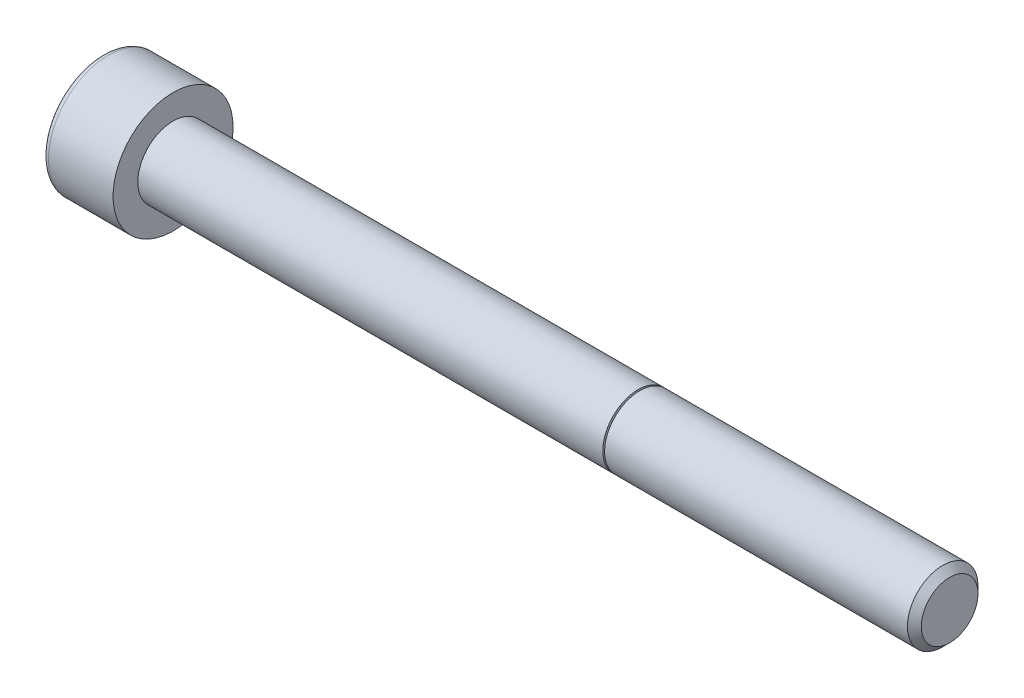
ISO-10303-21;
HEADER;
FILE_DESCRIPTION(('STEP AP214'),'2;1');
FILE_NAME('part.step','',(''),(''),'','','');
FILE_SCHEMA(('AUTOMOTIVE_DESIGN { 1 0 10303 214 1 1 1 1 }'));
ENDSEC;
DATA;
#1=APPLICATION_CONTEXT('core data for automotive mechanical design processes');
#2=APPLICATION_PROTOCOL_DEFINITION('international standard','automotive_design',2000,#1);
#3=PRODUCT_CONTEXT('',#1,'mechanical');
#4=PRODUCT('Part','Part','',(#3));
#5=PRODUCT_RELATED_PRODUCT_CATEGORY('part','',(#4));
#6=PRODUCT_DEFINITION_FORMATION('','',#4);
#7=PRODUCT_DEFINITION_CONTEXT('part definition',#1,'design');
#8=PRODUCT_DEFINITION('design','',#6,#7);
#9=PRODUCT_DEFINITION_SHAPE('','',#8);
#10=(LENGTH_UNIT() NAMED_UNIT(*) SI_UNIT(.MILLI.,.METRE.));
#11=(NAMED_UNIT(*) PLANE_ANGLE_UNIT() SI_UNIT($,.RADIAN.));
#12=(NAMED_UNIT(*) SI_UNIT($,.STERADIAN.) SOLID_ANGLE_UNIT());
#13=UNCERTAINTY_MEASURE_WITH_UNIT(LENGTH_MEASURE(1.E-05),#10,'distance_accuracy_value','');
#14=(GEOMETRIC_REPRESENTATION_CONTEXT(3) GLOBAL_UNCERTAINTY_ASSIGNED_CONTEXT((#13)) GLOBAL_UNIT_ASSIGNED_CONTEXT((#10,
#11,#12)) REPRESENTATION_CONTEXT('',''));
#15=CARTESIAN_POINT('',(0.,0.,0.));
#16=DIRECTION('',(0.,0.,1.));
#17=DIRECTION('',(1.,0.,0.));
#18=AXIS2_PLACEMENT_3D('',#15,#16,#17);
#19=CARTESIAN_POINT('',(55.,-2.04969,2.0095));
#20=DIRECTION('',(1.,0.,0.));
#21=DIRECTION('',(0.,0.,-1.));
#22=AXIS2_PLACEMENT_3D('',#19,#20,#21);
#23=PLANE('',#22);
#24=CARTESIAN_POINT('',(55.,0.,0.));
#25=DIRECTION('',(-1.,0.,0.));
#26=DIRECTION('',(0.,0.,1.));
#27=AXIS2_PLACEMENT_3D('',#24,#25,#26);
#28=CIRCLE('',#27,2.0095);
#29=CARTESIAN_POINT('',(55.,0.,2.0095));
#30=VERTEX_POINT('',#29);
#31=EDGE_CURVE('E20',#30,#30,#28,.T.);
#32=ORIENTED_EDGE('',*,*,#31,.F.);
#33=EDGE_LOOP('',(#32));
#34=FACE_BOUND('',#33,.T.);
#35=ADVANCED_FACE('F16',(#34),#23,.T.);
#36=CARTESIAN_POINT('',(55.,0.,0.));
#37=DIRECTION('',(-1.,0.,0.));
#38=DIRECTION('',(0.,0.,1.));
#39=AXIS2_PLACEMENT_3D('',#36,#37,#38);
#40=CONICAL_SURFACE('',#39,2.0095,0.78539816339745);
#41=ORIENTED_EDGE('',*,*,#31,.T.);
#42=EDGE_LOOP('',(#41));
#43=FACE_BOUND('',#42,.T.);
#44=CARTESIAN_POINT('',(54.5095,0.,0.));
#45=DIRECTION('',(-1.,0.,0.));
#46=DIRECTION('',(0.,-1.,0.));
#47=AXIS2_PLACEMENT_3D('',#44,#45,#46);
#48=CIRCLE('',#47,2.5);
#49=CARTESIAN_POINT('',(54.5095,-2.50000000000004,0.));
#50=VERTEX_POINT('',#49);
#51=EDGE_CURVE('E122',#50,#50,#48,.T.);
#52=ORIENTED_EDGE('',*,*,#51,.F.);
#53=EDGE_LOOP('',(#52));
#54=FACE_BOUND('',#53,.T.);
#55=ADVANCED_FACE('F235',(#43,#54),#40,.T.);
#56=CARTESIAN_POINT('',(54.5095,0.,0.));
#57=DIRECTION('',(-1.,0.,0.));
#58=DIRECTION('',(0.,-1.,0.));
#59=AXIS2_PLACEMENT_3D('',#56,#57,#58);
#60=CYLINDRICAL_SURFACE('',#59,2.5);
#61=CARTESIAN_POINT('',(33.0613125,0.,0.));
#62=DIRECTION('',(-1.,0.,0.));
#63=DIRECTION('',(0.,0.,1.));
#64=AXIS2_PLACEMENT_3D('',#61,#62,#63);
#65=CIRCLE('',#64,2.5);
#66=CARTESIAN_POINT('',(33.0613125,0.,2.5));
#67=VERTEX_POINT('',#66);
#68=EDGE_CURVE('E119',#67,#67,#65,.T.);
#69=ORIENTED_EDGE('',*,*,#68,.F.);
#70=EDGE_LOOP('',(#69));
#71=FACE_BOUND('',#70,.T.);
#72=ORIENTED_EDGE('',*,*,#51,.T.);
#73=EDGE_LOOP('',(#72));
#74=FACE_BOUND('',#73,.T.);
#75=ADVANCED_FACE('F229',(#71,#74),#60,.T.);
#76=CARTESIAN_POINT('',(33.,0.,0.));
#77=DIRECTION('',(1.,0.,0.));
#78=DIRECTION('',(0.,0.,-1.));
#79=AXIS2_PLACEMENT_3D('',#76,#77,#78);
#80=CONICAL_SURFACE('',#79,2.0095,1.44644133224812);
#81=CARTESIAN_POINT('',(33.,0.,0.));
#82=DIRECTION('',(-1.,0.,0.));
#83=DIRECTION('',(0.,0.,1.));
#84=AXIS2_PLACEMENT_3D('',#81,#82,#83);
#85=CIRCLE('',#84,2.0095);
#86=CARTESIAN_POINT('',(33.,0.,2.0095));
#87=VERTEX_POINT('',#86);
#88=EDGE_CURVE('E116',#87,#87,#85,.T.);
#89=ORIENTED_EDGE('',*,*,#88,.F.);
#90=EDGE_LOOP('',(#89));
#91=FACE_BOUND('',#90,.T.);
#92=ORIENTED_EDGE('',*,*,#68,.T.);
#93=EDGE_LOOP('',(#92));
#94=FACE_BOUND('',#93,.T.);
#95=ADVANCED_FACE('F223',(#91,#94),#80,.T.);
#96=CARTESIAN_POINT('',(32.9386875,0.,0.));
#97=DIRECTION('',(-1.,0.,0.));
#98=DIRECTION('',(0.,0.,1.));
#99=AXIS2_PLACEMENT_3D('',#96,#97,#98);
#100=CONICAL_SURFACE('',#99,2.5,1.44644133224812);
#101=CARTESIAN_POINT('',(32.9386875,0.,0.));
#102=DIRECTION('',(-1.,0.,0.));
#103=DIRECTION('',(0.,0.,1.));
#104=AXIS2_PLACEMENT_3D('',#101,#102,#103);
#105=CIRCLE('',#104,2.5);
#106=CARTESIAN_POINT('',(32.9386875,0.,2.49999999999996));
#107=VERTEX_POINT('',#106);
#108=EDGE_CURVE('E113',#107,#107,#105,.T.);
#109=ORIENTED_EDGE('',*,*,#108,.F.);
#110=EDGE_LOOP('',(#109));
#111=FACE_BOUND('',#110,.T.);
#112=ORIENTED_EDGE('',*,*,#88,.T.);
#113=EDGE_LOOP('',(#112));
#114=FACE_BOUND('',#113,.T.);
#115=ADVANCED_FACE('F218',(#111,#114),#100,.T.);
#116=CARTESIAN_POINT('',(32.9386875,0.,0.));
#117=DIRECTION('',(-1.,0.,0.));
#118=DIRECTION('',(0.,0.,1.));
#119=AXIS2_PLACEMENT_3D('',#116,#117,#118);
#120=CYLINDRICAL_SURFACE('',#119,2.5);
#121=CARTESIAN_POINT('',(0.,0.,0.));
#122=DIRECTION('',(-1.,0.,0.));
#123=DIRECTION('',(0.,0.,1.));
#124=AXIS2_PLACEMENT_3D('',#121,#122,#123);
#125=CIRCLE('',#124,2.5);
#126=CARTESIAN_POINT('',(0.,0.,2.49999999999996));
#127=VERTEX_POINT('',#126);
#128=EDGE_CURVE('E92',#127,#127,#125,.T.);
#129=ORIENTED_EDGE('',*,*,#128,.F.);
#130=EDGE_LOOP('',(#129));
#131=FACE_BOUND('',#130,.T.);
#132=ORIENTED_EDGE('',*,*,#108,.T.);
#133=EDGE_LOOP('',(#132));
#134=FACE_BOUND('',#133,.T.);
#135=ADVANCED_FACE('F215',(#131,#134),#120,.T.);
#136=CARTESIAN_POINT('',(-1.9,0.,0.));
#137=DIRECTION('',(-1.,0.,0.));
#138=DIRECTION('',(0.,0.,1.));
#139=AXIS2_PLACEMENT_3D('',#136,#137,#138);
#140=CONICAL_SURFACE('',#139,2.3094010767585,1.0471975511966);
#141=CARTESIAN_POINT('',(-1.9,0.,2.3094010767585));
#142=CARTESIAN_POINT('',(-1.87069554512665,-0.0878878875630438,2.25865898121547));
#143=CARTESIAN_POINT('',(-1.84404467710022,-0.176534422121215,2.20747888062559));
#144=CARTESIAN_POINT('',(-1.79752638740027,-0.355362346686105,2.10423253023943));
#145=CARTESIAN_POINT('',(-1.77767542033809,-0.44554691308464,2.05216444655249));
#146=CARTESIAN_POINT('',(-1.74677595894609,-0.624798433758891,1.94867353283856));
#147=CARTESIAN_POINT('',(-1.73552178759691,-0.713837815616439,1.89726662175463));
#148=CARTESIAN_POINT('',(-1.72208916813045,-0.892335320462004,1.79421103928237));
#149=CARTESIAN_POINT('',(-1.7198995939742,-0.981792795105295,1.74256274221605));
#150=CARTESIAN_POINT('',(-1.72446629015479,-1.14893448970974,1.64606343984337));
#151=CARTESIAN_POINT('',(-1.73010128521626,-1.22664379064383,1.60119795403054));
#152=CARTESIAN_POINT('',(-1.74795730071816,-1.38155614176471,1.5117592664101));
#153=CARTESIAN_POINT('',(-1.76018441476867,-1.45875865655097,1.46718637371614));
#154=CARTESIAN_POINT('',(-1.79074983333835,-1.61399014172453,1.37756343396448));
#155=CARTESIAN_POINT('',(-1.80921764221832,-1.69199947538354,1.33252472417715));
#156=CARTESIAN_POINT('',(-1.85113176083937,-1.84685497000488,1.24311886267203));
#157=CARTESIAN_POINT('',(-1.87456822875222,-1.92370311331472,1.19875056644538));
#158=CARTESIAN_POINT('',(-1.90000000000001,-1.99999999999999,1.15470053837931));
#159=B_SPLINE_CURVE_WITH_KNOTS('',3,(#141,#142,#143,#144,#145,#146,#147,#148,#149,#150,#151,
#152,#153,#154,#155,#156,#157,#158),.UNSPECIFIED.,.F.,.F.,(4,2,2,2,2,2,2,2,4),(0.,
0.317016011556855,0.634793817027109,0.944707606152922,1.25424088889782,1.52370778263188,
1.79342419379439,2.06912162248864,2.34427797351492),.UNSPECIFIED.);
#160=CARTESIAN_POINT('',(-1.9,0.,2.3094010767585));
#161=VERTEX_POINT('',#160);
#162=CARTESIAN_POINT('',(-1.90000000000001,-2.,1.1547005383793));
#163=VERTEX_POINT('',#162);
#164=EDGE_CURVE('E82',#161,#163,#159,.T.);
#165=ORIENTED_EDGE('',*,*,#164,.F.);
#166=CARTESIAN_POINT('',(-1.90000000000002,2.,1.1547005383793));
#167=CARTESIAN_POINT('',(-1.87069554512667,1.91211211243696,1.20544263392233));
#168=CARTESIAN_POINT('',(-1.84404467710023,1.82346557787879,1.25662273451221));
#169=CARTESIAN_POINT('',(-1.79752638740028,1.6446376533139,1.35986908489837));
#170=CARTESIAN_POINT('',(-1.7776754203381,1.55445308691536,1.41193716858531));
#171=CARTESIAN_POINT('',(-1.74677595894609,1.37520156624111,1.51542808229924));
#172=CARTESIAN_POINT('',(-1.73552178759691,1.28616218438356,1.56683499338317));
#173=CARTESIAN_POINT('',(-1.72208916813045,1.10766467953799,1.66989057585543));
#174=CARTESIAN_POINT('',(-1.7198995939742,1.0182072048947,1.72153887292176));
#175=CARTESIAN_POINT('',(-1.72446629015479,0.851065510290257,1.81803817529444));
#176=CARTESIAN_POINT('',(-1.73010128521625,0.773356209356166,1.86290366110727));
#177=CARTESIAN_POINT('',(-1.74795730071815,0.618443858235278,1.95234234872771));
#178=CARTESIAN_POINT('',(-1.76018441476867,0.541241343449025,1.99691524142166));
#179=CARTESIAN_POINT('',(-1.79074983333834,0.386009858275461,2.08653818117332));
#180=CARTESIAN_POINT('',(-1.80921764221831,0.308000524616451,2.13157689096065));
#181=CARTESIAN_POINT('',(-1.85113176083936,0.153145029995107,2.22098275246578));
#182=CARTESIAN_POINT('',(-1.87456822875221,0.0762968866852722,2.26535104869243));
#183=CARTESIAN_POINT('',(-1.9,0.,2.3094010767585));
#184=B_SPLINE_CURVE_WITH_KNOTS('',3,(#166,#167,#168,#169,#170,#171,#172,#173,#174,#175,#176,
#177,#178,#179,#180,#181,#182,#183),.UNSPECIFIED.,.F.,.F.,(4,2,2,2,2,2,2,2,4),(0.,
0.317016011556859,0.634793817027117,0.944707606152934,1.25424088889784,1.5237077826319,
1.7934241937944,2.06912162248865,2.34427797351493),.UNSPECIFIED.);
#185=CARTESIAN_POINT('',(-1.90000000000001,2.,1.15470053837929));
#186=VERTEX_POINT('',#185);
#187=EDGE_CURVE('E79',#186,#161,#184,.T.);
#188=ORIENTED_EDGE('',*,*,#187,.F.);
#189=CARTESIAN_POINT('',(-1.9,2.,-1.15470053837923));
#190=CARTESIAN_POINT('',(-1.87069554512665,2.,-1.05321634729317));
#191=CARTESIAN_POINT('',(-1.84404467710021,2.,-0.950856146113392));
#192=CARTESIAN_POINT('',(-1.79752638740026,2.,-0.744363445341073));
#193=CARTESIAN_POINT('',(-1.77767542033809,2.,-0.640227277967187));
#194=CARTESIAN_POINT('',(-1.74677595894608,2.,-0.433245450539333));
#195=CARTESIAN_POINT('',(-1.7355217875969,2.,-0.330431628371469));
#196=CARTESIAN_POINT('',(-1.72208916813044,2.,-0.124320463426946));
#197=CARTESIAN_POINT('',(-1.71989959397419,2.,-0.0210238692942912));
#198=CARTESIAN_POINT('',(-1.72446629015478,2.,0.171974735451078));
#199=CARTESIAN_POINT('',(-1.73010128521625,2.,0.261705707076751));
#200=CARTESIAN_POINT('',(-1.74795730071815,2.,0.44058308231764));
#201=CARTESIAN_POINT('',(-1.76018441476866,2.,0.529728867705562));
#202=CARTESIAN_POINT('',(-1.79074983333834,2.,0.708974747208891));
#203=CARTESIAN_POINT('',(-1.80921764221831,2.,0.799052166783559));
#204=CARTESIAN_POINT('',(-1.85113176083936,2.,0.977863889793815));
#205=CARTESIAN_POINT('',(-1.87456822875222,2.,1.06660048224713));
#206=CARTESIAN_POINT('',(-1.90000000000001,2.,1.15470053837928));
#207=B_SPLINE_CURVE_WITH_KNOTS('',3,(#189,#190,#191,#192,#193,#194,#195,#196,#197,#198,#199,
#200,#201,#202,#203,#204,#205,#206),.UNSPECIFIED.,.F.,.F.,(4,2,2,2,2,2,2,2,4),(0.,
0.317016011556853,0.634793817027106,0.944707606152917,1.25424088889781,1.52370778263189,
1.7934241937944,2.06912162248866,2.34427797351496),.UNSPECIFIED.);
#208=CARTESIAN_POINT('',(-1.89999999999999,2.,-1.15470053837921));
#209=VERTEX_POINT('',#208);
#210=EDGE_CURVE('E67',#209,#186,#207,.T.);
#211=ORIENTED_EDGE('',*,*,#210,.F.);
#212=CARTESIAN_POINT('',(-1.9,0.,-2.3094010767585));
#213=CARTESIAN_POINT('',(-1.87069554512665,0.0878878875630413,-2.25865898121547));
#214=CARTESIAN_POINT('',(-1.84404467710021,0.17653442212121,-2.20747888062558));
#215=CARTESIAN_POINT('',(-1.79752638740026,0.355362346686095,-2.10423253023942));
#216=CARTESIAN_POINT('',(-1.77767542033808,0.445546913084628,-2.05216444655247));
#217=CARTESIAN_POINT('',(-1.74677595894607,0.624798433758874,-1.94867353283854));
#218=CARTESIAN_POINT('',(-1.73552178759689,0.71383781561642,-1.89726662175461));
#219=CARTESIAN_POINT('',(-1.72208916813043,0.89233532046198,-1.79421103928234));
#220=CARTESIAN_POINT('',(-1.71989959397418,0.981792795105269,-1.74256274221601));
#221=CARTESIAN_POINT('',(-1.72446629015476,1.14893448970971,-1.64606343984333));
#222=CARTESIAN_POINT('',(-1.73010128521623,1.2266437906438,-1.60119795403049));
#223=CARTESIAN_POINT('',(-1.74795730071813,1.3815561417647,-1.51175926641004));
#224=CARTESIAN_POINT('',(-1.76018441476864,1.45875865655095,-1.46718637371607));
#225=CARTESIAN_POINT('',(-1.79074983333831,1.61399014172452,-1.37756343396441));
#226=CARTESIAN_POINT('',(-1.80921764221829,1.69199947538354,-1.33252472417707));
#227=CARTESIAN_POINT('',(-1.85113176083934,1.84685497000489,-1.24311886267194));
#228=CARTESIAN_POINT('',(-1.87456822875219,1.92370311331472,-1.19875056644528));
#229=CARTESIAN_POINT('',(-1.89999999999999,2.,-1.1547005383792));
#230=B_SPLINE_CURVE_WITH_KNOTS('',3,(#212,#213,#214,#215,#216,#217,#218,#219,#220,#221,#222,
#223,#224,#225,#226,#227,#228,#229),.UNSPECIFIED.,.F.,.F.,(4,2,2,2,2,2,2,2,4),(0.,
0.317016011556855,0.634793817027109,0.944707606152921,1.25424088889782,1.5237077826319,
1.79342419379442,2.06912162248868,2.34427797351498),.UNSPECIFIED.);
#231=CARTESIAN_POINT('',(-1.9,0.,-2.3094010767585));
#232=VERTEX_POINT('',#231);
#233=EDGE_CURVE('E134',#232,#209,#230,.T.);
#234=ORIENTED_EDGE('',*,*,#233,.F.);
#235=CARTESIAN_POINT('',(-1.90000000000001,-1.99999999999999,-1.1547005383793));
#236=CARTESIAN_POINT('',(-1.87069554512666,-1.91211211243695,-1.20544263392233));
#237=CARTESIAN_POINT('',(-1.84404467710023,-1.82346557787878,-1.25662273451222));
#238=CARTESIAN_POINT('',(-1.79752638740027,-1.64463765331388,-1.35986908489838));
#239=CARTESIAN_POINT('',(-1.7776754203381,-1.55445308691535,-1.41193716858532));
#240=CARTESIAN_POINT('',(-1.74677595894609,-1.3752015662411,-1.51542808229924));
#241=CARTESIAN_POINT('',(-1.73552178759691,-1.28616218438355,-1.56683499338317));
#242=CARTESIAN_POINT('',(-1.72208916813045,-1.10766467953798,-1.66989057585543));
#243=CARTESIAN_POINT('',(-1.7198995939742,-1.01820720489469,-1.72153887292176));
#244=CARTESIAN_POINT('',(-1.72446629015479,-0.851065510290249,-1.81803817529444));
#245=CARTESIAN_POINT('',(-1.73010128521626,-0.773356209356158,-1.86290366110727));
#246=CARTESIAN_POINT('',(-1.74795730071816,-0.618443858235273,-1.95234234872771));
#247=CARTESIAN_POINT('',(-1.76018441476867,-0.541241343449019,-1.99691524142167));
#248=CARTESIAN_POINT('',(-1.79074983333834,-0.386009858275457,-2.08653818117332));
#249=CARTESIAN_POINT('',(-1.80921764221831,-0.308000524616448,-2.13157689096065));
#250=CARTESIAN_POINT('',(-1.85113176083936,-0.153145029995106,-2.22098275246578));
#251=CARTESIAN_POINT('',(-1.87456822875221,-0.0762968866852709,-2.26535104869243));
#252=CARTESIAN_POINT('',(-1.9,0.,-2.3094010767585));
#253=B_SPLINE_CURVE_WITH_KNOTS('',3,(#235,#236,#237,#238,#239,#240,#241,#242,#243,#244,#245,
#246,#247,#248,#249,#250,#251,#252),.UNSPECIFIED.,.F.,.F.,(4,2,2,2,2,2,2,2,4),(0.,
0.317016011556858,0.634793817027115,0.944707606152931,1.25424088889783,1.52370778263189,
1.79342419379439,2.06912162248864,2.34427797351492),.UNSPECIFIED.);
#254=CARTESIAN_POINT('',(-1.90000000000001,-2.,-1.1547005383793));
#255=VERTEX_POINT('',#254);
#256=EDGE_CURVE('E142',#255,#232,#253,.T.);
#257=ORIENTED_EDGE('',*,*,#256,.F.);
#258=CARTESIAN_POINT('',(-1.90000000000001,-2.,1.15470053837929));
#259=CARTESIAN_POINT('',(-1.87069554512666,-2.,1.05321634729323));
#260=CARTESIAN_POINT('',(-1.84404467710023,-2.,0.950856146113455));
#261=CARTESIAN_POINT('',(-1.79752638740027,-2.,0.744363445341134));
#262=CARTESIAN_POINT('',(-1.7776754203381,-2.,0.640227277967246));
#263=CARTESIAN_POINT('',(-1.74677595894609,-2.,0.43324545053939));
#264=CARTESIAN_POINT('',(-1.73552178759691,-2.,0.330431628371524));
#265=CARTESIAN_POINT('',(-1.72208916813044,-2.,0.124320463426999));
#266=CARTESIAN_POINT('',(-1.71989959397419,-2.,0.0210238692943427));
#267=CARTESIAN_POINT('',(-1.72446629015478,-2.,-0.171974735451032));
#268=CARTESIAN_POINT('',(-1.73010128521624,-2.,-0.261705707076711));
#269=CARTESIAN_POINT('',(-1.74795730071814,-2.,-0.440583082317611));
#270=CARTESIAN_POINT('',(-1.76018441476866,-2.,-0.529728867705538));
#271=CARTESIAN_POINT('',(-1.79074983333833,-2.,-0.708974747208878));
#272=CARTESIAN_POINT('',(-1.80921764221831,-2.,-0.799052166783552));
#273=CARTESIAN_POINT('',(-1.85113176083936,-2.,-0.977863889793819));
#274=CARTESIAN_POINT('',(-1.87456822875222,-2.,-1.06660048224714));
#275=CARTESIAN_POINT('',(-1.90000000000001,-2.,-1.15470053837929));
#276=B_SPLINE_CURVE_WITH_KNOTS('',3,(#258,#259,#260,#261,#262,#263,#264,#265,#266,#267,#268,
#269,#270,#271,#272,#273,#274,#275),.UNSPECIFIED.,.F.,.F.,(4,2,2,2,2,2,2,2,4),(0.,
0.317016011556858,0.634793817027115,0.944707606152931,1.25424088889783,1.52370778263192,
1.79342419379445,2.06912162248873,2.34427797351504),.UNSPECIFIED.);
#277=EDGE_CURVE('E184',#163,#255,#276,.T.);
#278=ORIENTED_EDGE('',*,*,#277,.F.);
#279=EDGE_LOOP('',(#165,#188,#211,#234,#257,#278));
#280=FACE_BOUND('',#279,.T.);
#281=CARTESIAN_POINT('',(-0.56666666666667,0.,0.));
#282=VERTEX_POINT('',#281);
#283=VERTEX_LOOP('',#282);
#284=FACE_BOUND('',#283,.T.);
#285=ADVANCED_FACE('F80',(#280,#284),#140,.F.);
#286=CARTESIAN_POINT('',(0.,-4.335,4.25));
#287=DIRECTION('',(1.,0.,0.));
#288=DIRECTION('',(0.,0.,-1.));
#289=AXIS2_PLACEMENT_3D('',#286,#287,#288);
#290=PLANE('',#289);
#291=CARTESIAN_POINT('',(0.,0.,0.));
#292=DIRECTION('',(1.,0.,0.));
#293=DIRECTION('',(0.,0.,-1.));
#294=AXIS2_PLACEMENT_3D('',#291,#292,#293);
#295=CIRCLE('',#294,4.25);
#296=CARTESIAN_POINT('',(0.,0.,-4.25));
#297=VERTEX_POINT('',#296);
#298=EDGE_CURVE('E107',#297,#297,#295,.F.);
#299=ORIENTED_EDGE('',*,*,#298,.F.);
#300=EDGE_LOOP('',(#299));
#301=FACE_BOUND('',#300,.T.);
#302=ORIENTED_EDGE('',*,*,#128,.T.);
#303=EDGE_LOOP('',(#302));
#304=FACE_BOUND('',#303,.T.);
#305=ADVANCED_FACE('F213',(#301,#304),#290,.T.);
#306=CARTESIAN_POINT('',(-5.,2.,-1.1547005383793));
#307=DIRECTION('',(0.,-1.,0.));
#308=DIRECTION('',(1.,0.,0.));
#309=AXIS2_PLACEMENT_3D('',#306,#307,#308);
#310=PLANE('',#309);
#311=DIRECTION('',(0.,0.,1.));
#312=VECTOR('',#311,1.);
#313=CARTESIAN_POINT('',(-4.99999999995,2.,0.));
#314=LINE('',#313,#312);
#315=CARTESIAN_POINT('',(-4.99999999995,2.,-1.15470053837925));
#316=VERTEX_POINT('',#315);
#317=CARTESIAN_POINT('',(-4.99999999995,2.,1.1547005383793));
#318=VERTEX_POINT('',#317);
#319=EDGE_CURVE('E72',#316,#318,#314,.T.);
#320=ORIENTED_EDGE('',*,*,#319,.F.);
#321=DIRECTION('',(-1.,0.,0.));
#322=VECTOR('',#321,1.);
#323=CARTESIAN_POINT('',(-3.28333333333335,2.,-1.1547005383792));
#324=LINE('',#323,#322);
#325=EDGE_CURVE('E90',#209,#316,#324,.T.);
#326=ORIENTED_EDGE('',*,*,#325,.F.);
#327=ORIENTED_EDGE('',*,*,#210,.T.);
#328=DIRECTION('',(1.,0.,0.));
#329=VECTOR('',#328,1.);
#330=CARTESIAN_POINT('',(-3.28333333333335,2.,1.1547005383793));
#331=LINE('',#330,#329);
#332=EDGE_CURVE('E86',#318,#186,#331,.T.);
#333=ORIENTED_EDGE('',*,*,#332,.F.);
#334=EDGE_LOOP('',(#320,#326,#327,#333));
#335=FACE_BOUND('',#334,.T.);
#336=ADVANCED_FACE('F88',(#335),#310,.T.);
#337=CARTESIAN_POINT('',(-5.,2.,1.1547005383793));
#338=DIRECTION('',(0.,-0.499999999999983,-0.866025403784448));
#339=DIRECTION('',(1.,0.,0.));
#340=AXIS2_PLACEMENT_3D('',#337,#338,#339);
#341=PLANE('',#340);
#342=DIRECTION('',(0.,-0.866025403784448,0.499999999999983));
#343=VECTOR('',#342,1.);
#344=CARTESIAN_POINT('',(-4.99999999995,2.,1.1547005383793));
#345=LINE('',#344,#343);
#346=CARTESIAN_POINT('',(-4.99999999995,0.,2.3094010767585));
#347=VERTEX_POINT('',#346);
#348=EDGE_CURVE('E96',#318,#347,#345,.T.);
#349=ORIENTED_EDGE('',*,*,#348,.F.);
#350=ORIENTED_EDGE('',*,*,#332,.T.);
#351=ORIENTED_EDGE('',*,*,#187,.T.);
#352=DIRECTION('',(1.,0.,0.));
#353=VECTOR('',#352,1.);
#354=CARTESIAN_POINT('',(-3.28333333333335,0.,2.3094010767585));
#355=LINE('',#354,#353);
#356=EDGE_CURVE('E98',#347,#161,#355,.T.);
#357=ORIENTED_EDGE('',*,*,#356,.F.);
#358=EDGE_LOOP('',(#349,#350,#351,#357));
#359=FACE_BOUND('',#358,.T.);
#360=ADVANCED_FACE('F94',(#359),#341,.T.);
#361=CARTESIAN_POINT('',(-5.,0.,2.3094010767585));
#362=DIRECTION('',(0.,0.499999999999983,-0.866025403784448));
#363=DIRECTION('',(1.,0.,0.));
#364=AXIS2_PLACEMENT_3D('',#361,#362,#363);
#365=PLANE('',#364);
#366=DIRECTION('',(0.,-0.866025403784448,-0.499999999999983));
#367=VECTOR('',#366,1.);
#368=CARTESIAN_POINT('',(-4.99999999995,0.,2.3094010767585));
#369=LINE('',#368,#367);
#370=CARTESIAN_POINT('',(-4.99999999995,-2.,1.1547005383793));
#371=VERTEX_POINT('',#370);
#372=EDGE_CURVE('E112',#347,#371,#369,.T.);
#373=ORIENTED_EDGE('',*,*,#372,.F.);
#374=ORIENTED_EDGE('',*,*,#356,.T.);
#375=ORIENTED_EDGE('',*,*,#164,.T.);
#376=DIRECTION('',(1.,0.,0.));
#377=VECTOR('',#376,1.);
#378=CARTESIAN_POINT('',(-3.28333333333335,-2.,1.1547005383793));
#379=LINE('',#378,#377);
#380=EDGE_CURVE('E180',#371,#163,#379,.T.);
#381=ORIENTED_EDGE('',*,*,#380,.F.);
#382=EDGE_LOOP('',(#373,#374,#375,#381));
#383=FACE_BOUND('',#382,.T.);
#384=ADVANCED_FACE('F195',(#383),#365,.T.);
#385=CARTESIAN_POINT('',(-5.,-2.,1.1547005383793));
#386=DIRECTION('',(0.,1.,0.));
#387=DIRECTION('',(1.,0.,0.));
#388=AXIS2_PLACEMENT_3D('',#385,#386,#387);
#389=PLANE('',#388);
#390=DIRECTION('',(0.,0.,-1.));
#391=VECTOR('',#390,1.);
#392=CARTESIAN_POINT('',(-4.99999999995,-2.,0.));
#393=LINE('',#392,#391);
#394=CARTESIAN_POINT('',(-4.99999999995,-2.,-1.1547005383793));
#395=VERTEX_POINT('',#394);
#396=EDGE_CURVE('E108',#371,#395,#393,.T.);
#397=ORIENTED_EDGE('',*,*,#396,.F.);
#398=ORIENTED_EDGE('',*,*,#380,.T.);
#399=ORIENTED_EDGE('',*,*,#277,.T.);
#400=DIRECTION('',(1.,0.,0.));
#401=VECTOR('',#400,1.);
#402=CARTESIAN_POINT('',(-3.28333333333335,-2.,-1.1547005383793));
#403=LINE('',#402,#401);
#404=EDGE_CURVE('E141',#395,#255,#403,.T.);
#405=ORIENTED_EDGE('',*,*,#404,.F.);
#406=EDGE_LOOP('',(#397,#398,#399,#405));
#407=FACE_BOUND('',#406,.T.);
#408=ADVANCED_FACE('F192',(#407),#389,.T.);
#409=CARTESIAN_POINT('',(-5.,-2.,-1.1547005383793));
#410=DIRECTION('',(0.,0.499999999999983,0.866025403784448));
#411=DIRECTION('',(1.,0.,0.));
#412=AXIS2_PLACEMENT_3D('',#409,#410,#411);
#413=PLANE('',#412);
#414=DIRECTION('',(0.,0.866025403784448,-0.499999999999983));
#415=VECTOR('',#414,1.);
#416=CARTESIAN_POINT('',(-4.99999999995,-2.,-1.1547005383793));
#417=LINE('',#416,#415);
#418=CARTESIAN_POINT('',(-4.99999999995,0.,-2.3094010767585));
#419=VERTEX_POINT('',#418);
#420=EDGE_CURVE('E111',#395,#419,#417,.T.);
#421=ORIENTED_EDGE('',*,*,#420,.F.);
#422=ORIENTED_EDGE('',*,*,#404,.T.);
#423=ORIENTED_EDGE('',*,*,#256,.T.);
#424=DIRECTION('',(1.,0.,0.));
#425=VECTOR('',#424,1.);
#426=CARTESIAN_POINT('',(-3.28333333333335,0.,-2.3094010767585));
#427=LINE('',#426,#425);
#428=EDGE_CURVE('E35',#419,#232,#427,.T.);
#429=ORIENTED_EDGE('',*,*,#428,.F.);
#430=EDGE_LOOP('',(#421,#422,#423,#429));
#431=FACE_BOUND('',#430,.T.);
#432=ADVANCED_FACE('F156',(#431),#413,.T.);
#433=CARTESIAN_POINT('',(-5.,0.,-2.3094010767585));
#434=DIRECTION('',(0.,-0.500000000000015,0.86602540378443));
#435=DIRECTION('',(1.,0.,0.));
#436=AXIS2_PLACEMENT_3D('',#433,#434,#435);
#437=PLANE('',#436);
#438=DIRECTION('',(0.,0.866025403784448,0.499999999999983));
#439=VECTOR('',#438,1.);
#440=CARTESIAN_POINT('',(-4.99999999995,0.,-2.3094010767585));
#441=LINE('',#440,#439);
#442=EDGE_CURVE('E105',#419,#316,#441,.T.);
#443=ORIENTED_EDGE('',*,*,#442,.F.);
#444=ORIENTED_EDGE('',*,*,#428,.T.);
#445=ORIENTED_EDGE('',*,*,#233,.T.);
#446=ORIENTED_EDGE('',*,*,#325,.T.);
#447=EDGE_LOOP('',(#443,#444,#445,#446));
#448=FACE_BOUND('',#447,.T.);
#449=ADVANCED_FACE('F151',(#448),#437,.T.);
#450=CARTESIAN_POINT('',(-4.575,0.,0.));
#451=DIRECTION('',(1.,0.,0.));
#452=DIRECTION('',(0.,0.,-1.));
#453=AXIS2_PLACEMENT_3D('',#450,#451,#452);
#454=CYLINDRICAL_SURFACE('',#453,4.25);
#455=ORIENTED_EDGE('',*,*,#298,.T.);
#456=EDGE_LOOP('',(#455));
#457=FACE_BOUND('',#456,.T.);
#458=CARTESIAN_POINT('',(-4.575,0.,0.));
#459=DIRECTION('',(-1.,0.,0.));
#460=DIRECTION('',(0.,0.,1.));
#461=AXIS2_PLACEMENT_3D('',#458,#459,#460);
#462=CIRCLE('',#461,4.2499999999);
#463=CARTESIAN_POINT('',(-4.575,0.,4.2499999999));
#464=VERTEX_POINT('',#463);
#465=EDGE_CURVE('E26',#464,#464,#462,.T.);
#466=ORIENTED_EDGE('',*,*,#465,.F.);
#467=EDGE_LOOP('',(#466));
#468=FACE_BOUND('',#467,.T.);
#469=ADVANCED_FACE('F155',(#457,#468),#454,.T.);
#470=CARTESIAN_POINT('',(-4.99999999995,-3.9015,-3.825));
#471=DIRECTION('',(-1.,0.,0.));
#472=DIRECTION('',(0.,0.,1.));
#473=AXIS2_PLACEMENT_3D('',#470,#471,#472);
#474=PLANE('',#473);
#475=ORIENTED_EDGE('',*,*,#420,.T.);
#476=ORIENTED_EDGE('',*,*,#442,.T.);
#477=ORIENTED_EDGE('',*,*,#319,.T.);
#478=ORIENTED_EDGE('',*,*,#348,.T.);
#479=ORIENTED_EDGE('',*,*,#372,.T.);
#480=ORIENTED_EDGE('',*,*,#396,.T.);
#481=EDGE_LOOP('',(#475,#476,#477,#478,#479,#480));
#482=FACE_BOUND('',#481,.T.);
#483=CARTESIAN_POINT('',(-4.9999999999,0.,0.));
#484=DIRECTION('',(1.,0.,0.));
#485=DIRECTION('',(0.,0.,-1.));
#486=AXIS2_PLACEMENT_3D('',#483,#484,#485);
#487=CIRCLE('',#486,3.82499999995044);
#488=CARTESIAN_POINT('',(-4.9999999999,0.,-3.82499999995044));
#489=VERTEX_POINT('',#488);
#490=EDGE_CURVE('E10',#489,#489,#487,.T.);
#491=ORIENTED_EDGE('',*,*,#490,.F.);
#492=EDGE_LOOP('',(#491));
#493=FACE_BOUND('',#492,.T.);
#494=ADVANCED_FACE('F161',(#482,#493),#474,.T.);
#495=CARTESIAN_POINT('',(-4.5749999999,0.,0.));
#496=DIRECTION('',(1.,0.,0.));
#497=DIRECTION('',(0.,0.,-1.));
#498=AXIS2_PLACEMENT_3D('',#495,#496,#497);
#499=TOROIDAL_SURFACE('',#498,3.8249999999,0.425000000000002);
#500=ORIENTED_EDGE('',*,*,#490,.T.);
#501=EDGE_LOOP('',(#500));
#502=FACE_BOUND('',#501,.T.);
#503=ORIENTED_EDGE('',*,*,#465,.T.);
#504=EDGE_LOOP('',(#503));
#505=FACE_BOUND('',#504,.T.);
#506=ADVANCED_FACE('F18',(#502,#505),#499,.T.);
#507=CLOSED_SHELL('',(#35,#55,#75,#95,#115,#135,#285,#305,#336,#360,#384,#408,#432,#449,#469,
#494,#506));
#508=MANIFOLD_SOLID_BREP('B1',#507);
#509=ADVANCED_BREP_SHAPE_REPRESENTATION('',(#18,#508),#14);
#510=SHAPE_DEFINITION_REPRESENTATION(#9,#509);
ENDSEC;
END-ISO-10303-21;
